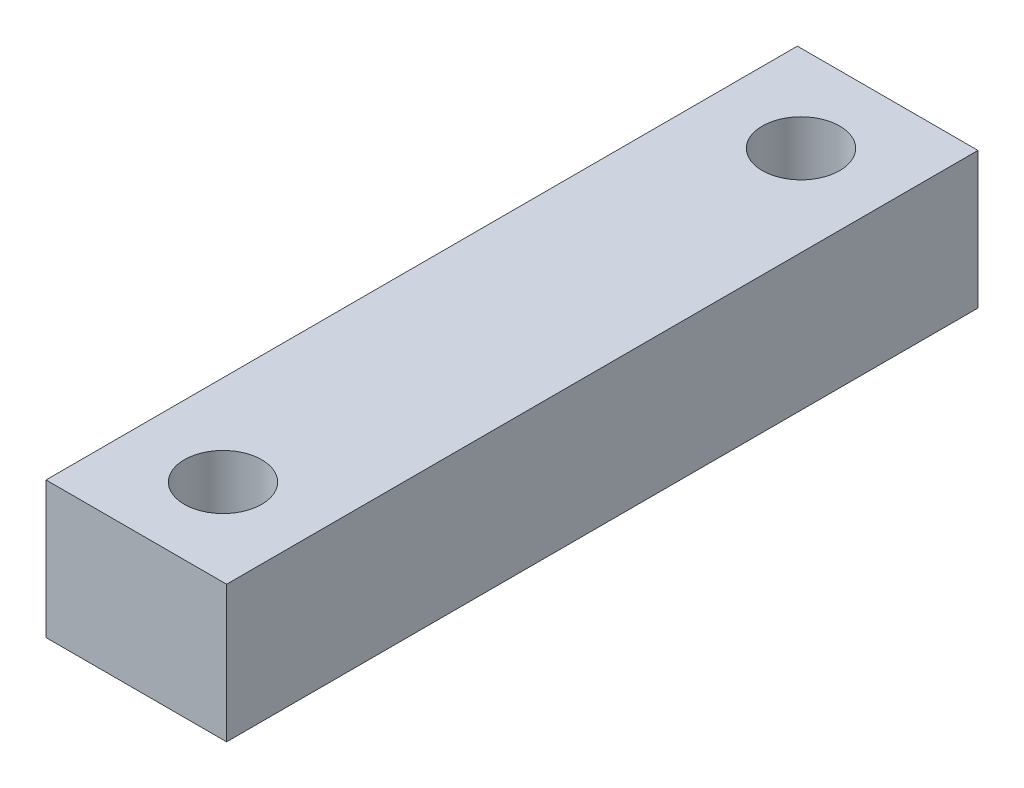
ISO-10303-21;
HEADER;
FILE_DESCRIPTION(('STEP AP214'),'2;1');
FILE_NAME('part.step','',(''),(''),'','','');
FILE_SCHEMA(('AUTOMOTIVE_DESIGN { 1 0 10303 214 1 1 1 1 }'));
ENDSEC;
DATA;
#1=APPLICATION_CONTEXT('core data for automotive mechanical design processes');
#2=APPLICATION_PROTOCOL_DEFINITION('international standard','automotive_design',2000,#1);
#3=PRODUCT_CONTEXT('',#1,'mechanical');
#4=PRODUCT('Part','Part','',(#3));
#5=PRODUCT_RELATED_PRODUCT_CATEGORY('part','',(#4));
#6=PRODUCT_DEFINITION_FORMATION('','',#4);
#7=PRODUCT_DEFINITION_CONTEXT('part definition',#1,'design');
#8=PRODUCT_DEFINITION('design','',#6,#7);
#9=PRODUCT_DEFINITION_SHAPE('','',#8);
#10=(LENGTH_UNIT() NAMED_UNIT(*) SI_UNIT(.MILLI.,.METRE.));
#11=(NAMED_UNIT(*) PLANE_ANGLE_UNIT() SI_UNIT($,.RADIAN.));
#12=(NAMED_UNIT(*) SI_UNIT($,.STERADIAN.) SOLID_ANGLE_UNIT());
#13=UNCERTAINTY_MEASURE_WITH_UNIT(LENGTH_MEASURE(1.E-05),#10,'distance_accuracy_value','');
#14=(GEOMETRIC_REPRESENTATION_CONTEXT(3) GLOBAL_UNCERTAINTY_ASSIGNED_CONTEXT((#13)) GLOBAL_UNIT_ASSIGNED_CONTEXT((#10,
#11,#12)) REPRESENTATION_CONTEXT('',''));
#15=CARTESIAN_POINT('',(0.,0.,0.));
#16=DIRECTION('',(0.,0.,1.));
#17=DIRECTION('',(1.,0.,0.));
#18=AXIS2_PLACEMENT_3D('',#15,#16,#17);
#19=CARTESIAN_POINT('',(0.,15.,0.));
#20=DIRECTION('',(0.,1.,0.));
#21=DIRECTION('',(0.,0.,1.));
#22=AXIS2_PLACEMENT_3D('',#19,#20,#21);
#23=PLANE('',#22);
#24=CARTESIAN_POINT('',(1.38777878078145E-13,15.,31.75));
#25=DIRECTION('',(0.,1.,0.));
#26=DIRECTION('',(0.,0.,1.));
#27=AXIS2_PLACEMENT_3D('',#24,#25,#26);
#28=CIRCLE('',#27,4.25);
#29=CARTESIAN_POINT('',(1.3594680936535E-13,15.,36.));
#30=VERTEX_POINT('',#29);
#31=EDGE_CURVE('E115',#30,#30,#28,.T.);
#32=ORIENTED_EDGE('',*,*,#31,.F.);
#33=EDGE_LOOP('',(#32));
#34=FACE_BOUND('',#33,.T.);
#35=DIRECTION('',(0.,0.,-1.));
#36=VECTOR('',#35,1.);
#37=CARTESIAN_POINT('',(9.92187500000016,15.0000000000002,-41.2750000000001));
#38=LINE('',#37,#36);
#39=CARTESIAN_POINT('',(9.921875,15.0000000000002,41.2749999999999));
#40=VERTEX_POINT('',#39);
#41=CARTESIAN_POINT('',(9.92187500000016,15.0000000000002,-41.2750000000001));
#42=VERTEX_POINT('',#41);
#43=EDGE_CURVE('E94',#40,#42,#38,.T.);
#44=ORIENTED_EDGE('',*,*,#43,.T.);
#45=DIRECTION('',(-1.,0.,0.));
#46=VECTOR('',#45,1.);
#47=CARTESIAN_POINT('',(-9.92187499999983,15.,-41.2750000000003));
#48=LINE('',#47,#46);
#49=CARTESIAN_POINT('',(-9.92187499999983,15.,-41.2750000000003));
#50=VERTEX_POINT('',#49);
#51=EDGE_CURVE('E89',#42,#50,#48,.T.);
#52=ORIENTED_EDGE('',*,*,#51,.T.);
#53=DIRECTION('',(0.,0.,1.));
#54=VECTOR('',#53,1.);
#55=CARTESIAN_POINT('',(-9.92187499999983,15.,-41.2750000000003));
#56=LINE('',#55,#54);
#57=CARTESIAN_POINT('',(-9.921875,15.,41.2749999999998));
#58=VERTEX_POINT('',#57);
#59=EDGE_CURVE('E92',#50,#58,#56,.T.);
#60=ORIENTED_EDGE('',*,*,#59,.T.);
#61=DIRECTION('',(1.,0.,0.));
#62=VECTOR('',#61,1.);
#63=CARTESIAN_POINT('',(-9.921875,15.,41.2749999999998));
#64=LINE('',#63,#62);
#65=EDGE_CURVE('E59',#58,#40,#64,.T.);
#66=ORIENTED_EDGE('',*,*,#65,.T.);
#67=EDGE_LOOP('',(#44,#52,#60,#66));
#68=FACE_BOUND('',#67,.T.);
#69=CARTESIAN_POINT('',(0.,15.,-31.7500000000002));
#70=DIRECTION('',(0.,1.,0.));
#71=DIRECTION('',(0.,0.,1.));
#72=AXIS2_PLACEMENT_3D('',#69,#70,#71);
#73=CIRCLE('',#72,4.25);
#74=CARTESIAN_POINT('',(0.,15.,-27.5000000000002));
#75=VERTEX_POINT('',#74);
#76=EDGE_CURVE('E139',#75,#75,#73,.T.);
#77=ORIENTED_EDGE('',*,*,#76,.F.);
#78=EDGE_LOOP('',(#77));
#79=FACE_BOUND('',#78,.T.);
#80=ADVANCED_FACE('F41',(#34,#68,#79),#23,.T.);
#81=CARTESIAN_POINT('',(0.,0.,0.));
#82=DIRECTION('',(0.,1.,0.));
#83=DIRECTION('',(0.,0.,1.));
#84=AXIS2_PLACEMENT_3D('',#81,#82,#83);
#85=PLANE('',#84);
#86=DIRECTION('',(0.,0.,-1.));
#87=VECTOR('',#86,1.);
#88=CARTESIAN_POINT('',(9.92187500000016,1.66533453693773E-13,-41.2750000000003));
#89=LINE('',#88,#87);
#90=CARTESIAN_POINT('',(9.921875,1.66533453693773E-13,41.2749999999998));
#91=VERTEX_POINT('',#90);
#92=CARTESIAN_POINT('',(9.92187500000016,1.66533453693773E-13,-41.2750000000003));
#93=VERTEX_POINT('',#92);
#94=EDGE_CURVE('E111',#91,#93,#89,.T.);
#95=ORIENTED_EDGE('',*,*,#94,.F.);
#96=DIRECTION('',(1.,0.,0.));
#97=VECTOR('',#96,1.);
#98=CARTESIAN_POINT('',(-9.92187500000002,0.,41.2749999999999));
#99=LINE('',#98,#97);
#100=CARTESIAN_POINT('',(-9.92187500000002,0.,41.2749999999999));
#101=VERTEX_POINT('',#100);
#102=EDGE_CURVE('E82',#101,#91,#99,.T.);
#103=ORIENTED_EDGE('',*,*,#102,.F.);
#104=DIRECTION('',(0.,0.,1.));
#105=VECTOR('',#104,1.);
#106=CARTESIAN_POINT('',(-9.92187499999997,0.,-41.2750000000002));
#107=LINE('',#106,#105);
#108=CARTESIAN_POINT('',(-9.92187499999997,0.,-41.2750000000002));
#109=VERTEX_POINT('',#108);
#110=EDGE_CURVE('E76',#109,#101,#107,.T.);
#111=ORIENTED_EDGE('',*,*,#110,.F.);
#112=DIRECTION('',(-1.,0.,0.));
#113=VECTOR('',#112,1.);
#114=CARTESIAN_POINT('',(-9.92187499999997,0.,-41.2750000000002));
#115=LINE('',#114,#113);
#116=EDGE_CURVE('E99',#93,#109,#115,.T.);
#117=ORIENTED_EDGE('',*,*,#116,.F.);
#118=EDGE_LOOP('',(#95,#103,#111,#117));
#119=FACE_BOUND('',#118,.T.);
#120=CARTESIAN_POINT('',(0.,0.,31.75));
#121=DIRECTION('',(0.,1.,0.));
#122=DIRECTION('',(0.,0.,1.));
#123=AXIS2_PLACEMENT_3D('',#120,#121,#122);
#124=CIRCLE('',#123,4.25);
#125=CARTESIAN_POINT('',(0.,0.,36.));
#126=VERTEX_POINT('',#125);
#127=EDGE_CURVE('E135',#126,#126,#124,.T.);
#128=ORIENTED_EDGE('',*,*,#127,.T.);
#129=EDGE_LOOP('',(#128));
#130=FACE_BOUND('',#129,.T.);
#131=CARTESIAN_POINT('',(0.,0.,-31.75));
#132=DIRECTION('',(0.,1.,0.));
#133=DIRECTION('',(0.,0.,1.));
#134=AXIS2_PLACEMENT_3D('',#131,#132,#133);
#135=CIRCLE('',#134,4.25);
#136=CARTESIAN_POINT('',(0.,0.,-27.5));
#137=VERTEX_POINT('',#136);
#138=EDGE_CURVE('E143',#137,#137,#135,.T.);
#139=ORIENTED_EDGE('',*,*,#138,.T.);
#140=EDGE_LOOP('',(#139));
#141=FACE_BOUND('',#140,.T.);
#142=ADVANCED_FACE('F129',(#119,#130,#141),#85,.F.);
#143=CARTESIAN_POINT('',(9.92187500000016,15.0000000000002,-41.2750000000001));
#144=DIRECTION('',(-1.,0.,0.));
#145=DIRECTION('',(0.,0.,1.));
#146=AXIS2_PLACEMENT_3D('',#143,#144,#145);
#147=PLANE('',#146);
#148=ORIENTED_EDGE('',*,*,#94,.T.);
#149=DIRECTION('',(0.,-1.,0.));
#150=VECTOR('',#149,1.);
#151=CARTESIAN_POINT('',(9.92187500000016,15.0000000000002,-41.2750000000001));
#152=LINE('',#151,#150);
#153=EDGE_CURVE('E11',#42,#93,#152,.T.);
#154=ORIENTED_EDGE('',*,*,#153,.F.);
#155=ORIENTED_EDGE('',*,*,#43,.F.);
#156=DIRECTION('',(0.,-1.,0.));
#157=VECTOR('',#156,1.);
#158=CARTESIAN_POINT('',(9.921875,15.0000000000002,41.2749999999999));
#159=LINE('',#158,#157);
#160=EDGE_CURVE('E107',#40,#91,#159,.T.);
#161=ORIENTED_EDGE('',*,*,#160,.T.);
#162=EDGE_LOOP('',(#148,#154,#155,#161));
#163=FACE_BOUND('',#162,.T.);
#164=ADVANCED_FACE('F43',(#163),#147,.F.);
#165=CARTESIAN_POINT('',(-9.92187499999983,15.,-41.2750000000003));
#166=DIRECTION('',(0.,0.,1.));
#167=DIRECTION('',(1.,0.,0.));
#168=AXIS2_PLACEMENT_3D('',#165,#166,#167);
#169=PLANE('',#168);
#170=ORIENTED_EDGE('',*,*,#116,.T.);
#171=DIRECTION('',(0.,-1.,0.));
#172=VECTOR('',#171,1.);
#173=CARTESIAN_POINT('',(-9.92187499999983,15.,-41.2750000000003));
#174=LINE('',#173,#172);
#175=EDGE_CURVE('E51',#50,#109,#174,.T.);
#176=ORIENTED_EDGE('',*,*,#175,.F.);
#177=ORIENTED_EDGE('',*,*,#51,.F.);
#178=ORIENTED_EDGE('',*,*,#153,.T.);
#179=EDGE_LOOP('',(#170,#176,#177,#178));
#180=FACE_BOUND('',#179,.T.);
#181=ADVANCED_FACE('F98',(#180),#169,.F.);
#182=CARTESIAN_POINT('',(-9.92187499999983,15.,-41.2750000000003));
#183=DIRECTION('',(1.,0.,0.));
#184=DIRECTION('',(0.,0.,-1.));
#185=AXIS2_PLACEMENT_3D('',#182,#183,#184);
#186=PLANE('',#185);
#187=ORIENTED_EDGE('',*,*,#110,.T.);
#188=DIRECTION('',(0.,-1.,0.));
#189=VECTOR('',#188,1.);
#190=CARTESIAN_POINT('',(-9.921875,15.,41.2749999999998));
#191=LINE('',#190,#189);
#192=EDGE_CURVE('E101',#58,#101,#191,.T.);
#193=ORIENTED_EDGE('',*,*,#192,.F.);
#194=ORIENTED_EDGE('',*,*,#59,.F.);
#195=ORIENTED_EDGE('',*,*,#175,.T.);
#196=EDGE_LOOP('',(#187,#193,#194,#195));
#197=FACE_BOUND('',#196,.T.);
#198=ADVANCED_FACE('F102',(#197),#186,.F.);
#199=CARTESIAN_POINT('',(-9.921875,15.,41.2749999999998));
#200=DIRECTION('',(0.,0.,-1.));
#201=DIRECTION('',(-1.,0.,0.));
#202=AXIS2_PLACEMENT_3D('',#199,#200,#201);
#203=PLANE('',#202);
#204=ORIENTED_EDGE('',*,*,#102,.T.);
#205=ORIENTED_EDGE('',*,*,#160,.F.);
#206=ORIENTED_EDGE('',*,*,#65,.F.);
#207=ORIENTED_EDGE('',*,*,#192,.T.);
#208=EDGE_LOOP('',(#204,#205,#206,#207));
#209=FACE_BOUND('',#208,.T.);
#210=ADVANCED_FACE('F126',(#209),#203,.F.);
#211=CARTESIAN_POINT('',(1.38777878078145E-13,15.,31.75));
#212=DIRECTION('',(0.,-1.,0.));
#213=DIRECTION('',(0.,0.,-1.));
#214=AXIS2_PLACEMENT_3D('',#211,#212,#213);
#215=CYLINDRICAL_SURFACE('',#214,4.25);
#216=ORIENTED_EDGE('',*,*,#31,.T.);
#217=EDGE_LOOP('',(#216));
#218=FACE_BOUND('',#217,.T.);
#219=ORIENTED_EDGE('',*,*,#127,.F.);
#220=EDGE_LOOP('',(#219));
#221=FACE_BOUND('',#220,.T.);
#222=ADVANCED_FACE('F163',(#218,#221),#215,.F.);
#223=CARTESIAN_POINT('',(0.,15.,-31.7500000000002));
#224=DIRECTION('',(0.,-1.,0.));
#225=DIRECTION('',(0.,0.,-1.));
#226=AXIS2_PLACEMENT_3D('',#223,#224,#225);
#227=CYLINDRICAL_SURFACE('',#226,4.25);
#228=ORIENTED_EDGE('',*,*,#76,.T.);
#229=EDGE_LOOP('',(#228));
#230=FACE_BOUND('',#229,.T.);
#231=ORIENTED_EDGE('',*,*,#138,.F.);
#232=EDGE_LOOP('',(#231));
#233=FACE_BOUND('',#232,.T.);
#234=ADVANCED_FACE('F152',(#230,#233),#227,.F.);
#235=CLOSED_SHELL('',(#80,#142,#164,#181,#198,#210,#222,#234));
#236=MANIFOLD_SOLID_BREP('B2',#235);
#237=ADVANCED_BREP_SHAPE_REPRESENTATION('',(#18,#236),#14);
#238=SHAPE_DEFINITION_REPRESENTATION(#9,#237);
ENDSEC;
END-ISO-10303-21;
